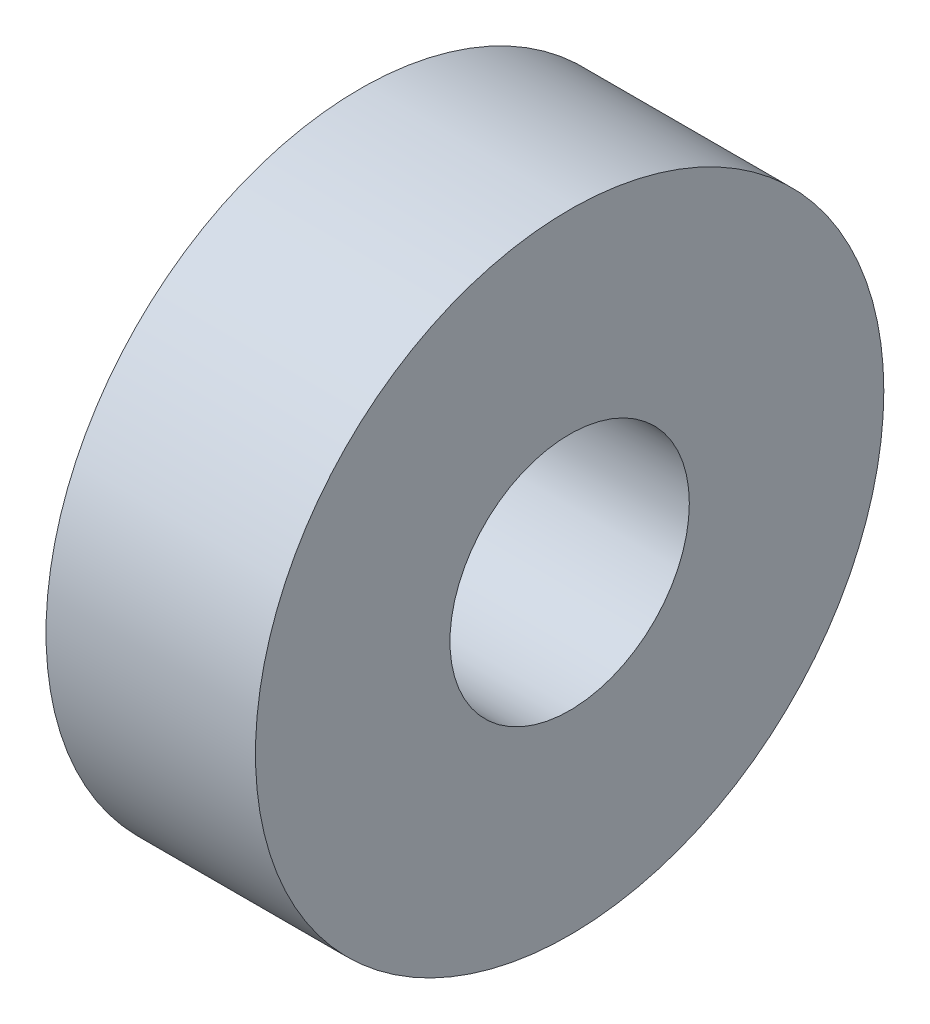
ISO-10303-21;
HEADER;
FILE_DESCRIPTION(('STEP AP214'),'2;1');
FILE_NAME('part.step','',(''),(''),'','','');
FILE_SCHEMA(('AUTOMOTIVE_DESIGN { 1 0 10303 214 1 1 1 1 }'));
ENDSEC;
DATA;
#1=APPLICATION_CONTEXT('core data for automotive mechanical design processes');
#2=APPLICATION_PROTOCOL_DEFINITION('international standard','automotive_design',2000,#1);
#3=PRODUCT_CONTEXT('',#1,'mechanical');
#4=PRODUCT('Part','Part','',(#3));
#5=PRODUCT_RELATED_PRODUCT_CATEGORY('part','',(#4));
#6=PRODUCT_DEFINITION_FORMATION('','',#4);
#7=PRODUCT_DEFINITION_CONTEXT('part definition',#1,'design');
#8=PRODUCT_DEFINITION('design','',#6,#7);
#9=PRODUCT_DEFINITION_SHAPE('','',#8);
#10=(LENGTH_UNIT() NAMED_UNIT(*) SI_UNIT(.MILLI.,.METRE.));
#11=(NAMED_UNIT(*) PLANE_ANGLE_UNIT() SI_UNIT($,.RADIAN.));
#12=(NAMED_UNIT(*) SI_UNIT($,.STERADIAN.) SOLID_ANGLE_UNIT());
#13=UNCERTAINTY_MEASURE_WITH_UNIT(LENGTH_MEASURE(1.E-05),#10,'distance_accuracy_value','');
#14=(GEOMETRIC_REPRESENTATION_CONTEXT(3) GLOBAL_UNCERTAINTY_ASSIGNED_CONTEXT((#13)) GLOBAL_UNIT_ASSIGNED_CONTEXT((#10,
#11,#12)) REPRESENTATION_CONTEXT('',''));
#15=CARTESIAN_POINT('',(0.,0.,0.));
#16=DIRECTION('',(0.,0.,1.));
#17=DIRECTION('',(1.,0.,0.));
#18=AXIS2_PLACEMENT_3D('',#15,#16,#17);
#19=CARTESIAN_POINT('',(7.,0.,0.));
#20=DIRECTION('',(1.,0.,0.));
#21=DIRECTION('',(0.,0.,-1.));
#22=AXIS2_PLACEMENT_3D('',#19,#20,#21);
#23=PLANE('',#22);
#24=CARTESIAN_POINT('',(7.,0.,0.));
#25=DIRECTION('',(1.,0.,0.));
#26=DIRECTION('',(0.,0.,-1.));
#27=AXIS2_PLACEMENT_3D('',#24,#25,#26);
#28=CIRCLE('',#27,10.5);
#29=CARTESIAN_POINT('',(7.,0.,-10.5));
#30=VERTEX_POINT('',#29);
#31=EDGE_CURVE('E11',#30,#30,#28,.T.);
#32=ORIENTED_EDGE('',*,*,#31,.T.);
#33=EDGE_LOOP('',(#32));
#34=FACE_BOUND('',#33,.T.);
#35=CARTESIAN_POINT('',(7.,0.,0.));
#36=DIRECTION('',(1.,0.,0.));
#37=DIRECTION('',(0.,0.,-1.));
#38=AXIS2_PLACEMENT_3D('',#35,#36,#37);
#39=CIRCLE('',#38,4.);
#40=CARTESIAN_POINT('',(7.,0.,-4.));
#41=VERTEX_POINT('',#40);
#42=EDGE_CURVE('E56',#41,#41,#39,.T.);
#43=ORIENTED_EDGE('',*,*,#42,.F.);
#44=EDGE_LOOP('',(#43));
#45=FACE_BOUND('',#44,.T.);
#46=ADVANCED_FACE('F43',(#34,#45),#23,.T.);
#47=CARTESIAN_POINT('',(0.,0.,0.));
#48=DIRECTION('',(1.,0.,0.));
#49=DIRECTION('',(0.,0.,-1.));
#50=AXIS2_PLACEMENT_3D('',#47,#48,#49);
#51=PLANE('',#50);
#52=CARTESIAN_POINT('',(0.,0.,0.));
#53=DIRECTION('',(1.,0.,0.));
#54=DIRECTION('',(0.,0.,-1.));
#55=AXIS2_PLACEMENT_3D('',#52,#53,#54);
#56=CIRCLE('',#55,10.5);
#57=CARTESIAN_POINT('',(0.,0.,-10.5));
#58=VERTEX_POINT('',#57);
#59=EDGE_CURVE('E47',#58,#58,#56,.T.);
#60=ORIENTED_EDGE('',*,*,#59,.F.);
#61=EDGE_LOOP('',(#60));
#62=FACE_BOUND('',#61,.T.);
#63=CARTESIAN_POINT('',(0.,0.,0.));
#64=DIRECTION('',(1.,0.,0.));
#65=DIRECTION('',(0.,0.,-1.));
#66=AXIS2_PLACEMENT_3D('',#63,#64,#65);
#67=CIRCLE('',#66,4.);
#68=CARTESIAN_POINT('',(0.,0.,-4.));
#69=VERTEX_POINT('',#68);
#70=EDGE_CURVE('E58',#69,#69,#67,.T.);
#71=ORIENTED_EDGE('',*,*,#70,.T.);
#72=EDGE_LOOP('',(#71));
#73=FACE_BOUND('',#72,.T.);
#74=ADVANCED_FACE('F70',(#62,#73),#51,.F.);
#75=CARTESIAN_POINT('',(7.,0.,0.));
#76=DIRECTION('',(-1.,0.,0.));
#77=DIRECTION('',(0.,0.,1.));
#78=AXIS2_PLACEMENT_3D('',#75,#76,#77);
#79=CYLINDRICAL_SURFACE('',#78,10.5);
#80=ORIENTED_EDGE('',*,*,#31,.F.);
#81=EDGE_LOOP('',(#80));
#82=FACE_BOUND('',#81,.T.);
#83=ORIENTED_EDGE('',*,*,#59,.T.);
#84=EDGE_LOOP('',(#83));
#85=FACE_BOUND('',#84,.T.);
#86=ADVANCED_FACE('F45',(#82,#85),#79,.T.);
#87=CARTESIAN_POINT('',(7.,0.,0.));
#88=DIRECTION('',(-1.,0.,0.));
#89=DIRECTION('',(0.,0.,1.));
#90=AXIS2_PLACEMENT_3D('',#87,#88,#89);
#91=CYLINDRICAL_SURFACE('',#90,4.);
#92=ORIENTED_EDGE('',*,*,#42,.T.);
#93=EDGE_LOOP('',(#92));
#94=FACE_BOUND('',#93,.T.);
#95=ORIENTED_EDGE('',*,*,#70,.F.);
#96=EDGE_LOOP('',(#95));
#97=FACE_BOUND('',#96,.T.);
#98=ADVANCED_FACE('F66',(#94,#97),#91,.F.);
#99=CLOSED_SHELL('',(#46,#74,#86,#98));
#100=MANIFOLD_SOLID_BREP('B2',#99);
#101=ADVANCED_BREP_SHAPE_REPRESENTATION('',(#18,#100),#14);
#102=SHAPE_DEFINITION_REPRESENTATION(#9,#101);
ENDSEC;
END-ISO-10303-21;
